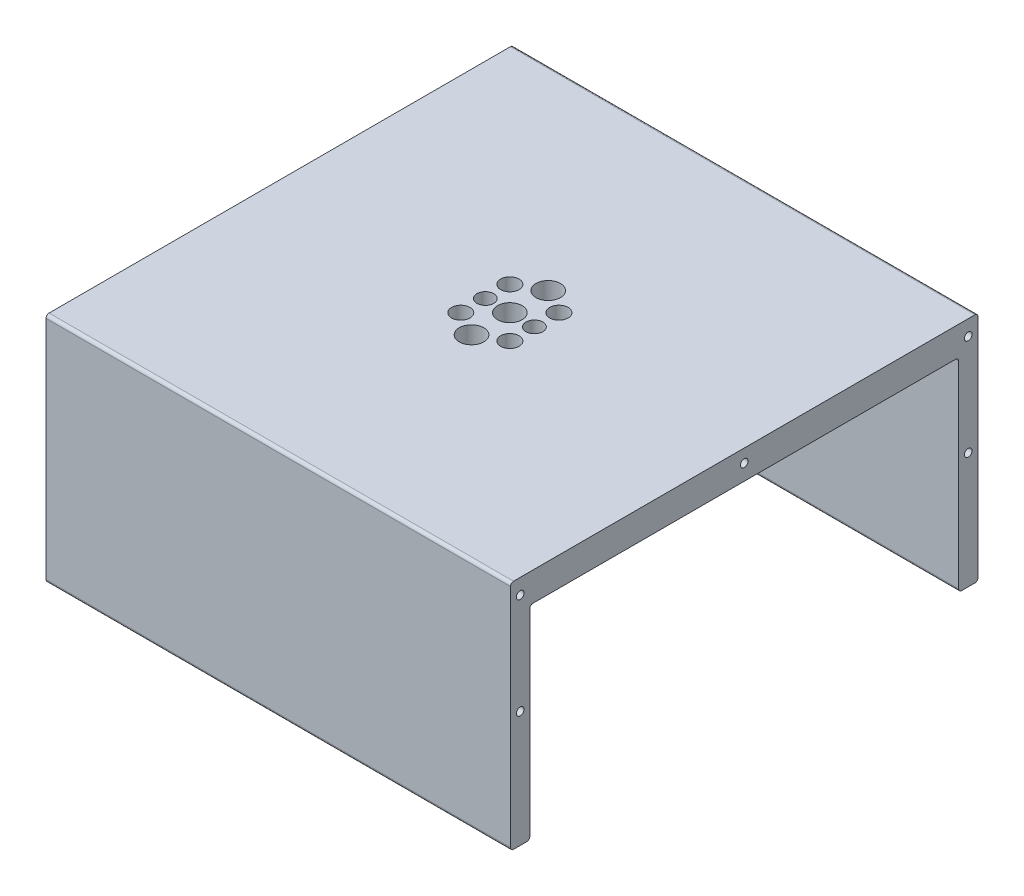
ISO-10303-21;
HEADER;
FILE_DESCRIPTION(('STEP AP214'),'2;1');
FILE_NAME('part.step','',(''),(''),'','','');
FILE_SCHEMA(('AUTOMOTIVE_DESIGN { 1 0 10303 214 1 1 1 1 }'));
ENDSEC;
DATA;
#1=APPLICATION_CONTEXT('core data for automotive mechanical design processes');
#2=APPLICATION_PROTOCOL_DEFINITION('international standard','automotive_design',2000,#1);
#3=PRODUCT_CONTEXT('',#1,'mechanical');
#4=PRODUCT('Part','Part','',(#3));
#5=PRODUCT_RELATED_PRODUCT_CATEGORY('part','',(#4));
#6=PRODUCT_DEFINITION_FORMATION('','',#4);
#7=PRODUCT_DEFINITION_CONTEXT('part definition',#1,'design');
#8=PRODUCT_DEFINITION('design','',#6,#7);
#9=PRODUCT_DEFINITION_SHAPE('','',#8);
#10=(LENGTH_UNIT() NAMED_UNIT(*) SI_UNIT(.MILLI.,.METRE.));
#11=(NAMED_UNIT(*) PLANE_ANGLE_UNIT() SI_UNIT($,.RADIAN.));
#12=(NAMED_UNIT(*) SI_UNIT($,.STERADIAN.) SOLID_ANGLE_UNIT());
#13=UNCERTAINTY_MEASURE_WITH_UNIT(LENGTH_MEASURE(1.E-05),#10,'distance_accuracy_value','');
#14=(GEOMETRIC_REPRESENTATION_CONTEXT(3) GLOBAL_UNCERTAINTY_ASSIGNED_CONTEXT((#13)) GLOBAL_UNIT_ASSIGNED_CONTEXT((#10,
#11,#12)) REPRESENTATION_CONTEXT('',''));
#15=CARTESIAN_POINT('',(0.,0.,0.));
#16=DIRECTION('',(0.,0.,1.));
#17=DIRECTION('',(1.,0.,0.));
#18=AXIS2_PLACEMENT_3D('',#15,#16,#17);
#19=CARTESIAN_POINT('',(151.4,27.45,-68.9));
#20=DIRECTION('',(-1.,0.,0.));
#21=DIRECTION('',(0.,0.,1.));
#22=AXIS2_PLACEMENT_3D('',#19,#20,#21);
#23=CYLINDRICAL_SURFACE('',#22,1.);
#24=CARTESIAN_POINT('',(0.,27.45,-68.9));
#25=DIRECTION('',(-1.,0.,0.));
#26=DIRECTION('',(0.,0.,-1.));
#27=AXIS2_PLACEMENT_3D('',#24,#25,#26);
#28=CIRCLE('',#27,1.);
#29=CARTESIAN_POINT('',(0.,28.45,-68.9));
#30=VERTEX_POINT('',#29);
#31=CARTESIAN_POINT('',(0.,27.45,-69.9));
#32=VERTEX_POINT('',#31);
#33=EDGE_CURVE('E192',#30,#32,#28,.T.);
#34=ORIENTED_EDGE('',*,*,#33,.T.);
#35=DIRECTION('',(-1.,0.,0.));
#36=VECTOR('',#35,1.);
#37=CARTESIAN_POINT('',(151.4,27.45,-69.9));
#38=LINE('',#37,#36);
#39=CARTESIAN_POINT('',(151.4,27.45,-69.9));
#40=VERTEX_POINT('',#39);
#41=EDGE_CURVE('E12',#40,#32,#38,.T.);
#42=ORIENTED_EDGE('',*,*,#41,.F.);
#43=CARTESIAN_POINT('',(151.4,27.45,-68.9));
#44=DIRECTION('',(-1.,0.,0.));
#45=DIRECTION('',(0.,0.,-1.));
#46=AXIS2_PLACEMENT_3D('',#43,#44,#45);
#47=CIRCLE('',#46,1.);
#48=CARTESIAN_POINT('',(151.4,28.45,-68.9));
#49=VERTEX_POINT('',#48);
#50=EDGE_CURVE('E336',#49,#40,#47,.T.);
#51=ORIENTED_EDGE('',*,*,#50,.F.);
#52=DIRECTION('',(-1.,0.,0.));
#53=VECTOR('',#52,1.);
#54=CARTESIAN_POINT('',(151.4,28.45,-68.9));
#55=LINE('',#54,#53);
#56=EDGE_CURVE('E188',#49,#30,#55,.T.);
#57=ORIENTED_EDGE('',*,*,#56,.T.);
#58=EDGE_LOOP('',(#34,#42,#51,#57));
#59=FACE_BOUND('',#58,.T.);
#60=ADVANCED_FACE('F43',(#59),#23,.F.);
#61=CARTESIAN_POINT('',(151.4,27.45,-69.9));
#62=DIRECTION('',(0.,0.,-1.));
#63=DIRECTION('',(0.,1.,0.));
#64=AXIS2_PLACEMENT_3D('',#61,#62,#63);
#65=PLANE('',#64);
#66=DIRECTION('',(0.,-1.,0.));
#67=VECTOR('',#66,1.);
#68=CARTESIAN_POINT('',(0.,27.45,-69.9));
#69=LINE('',#68,#67);
#70=CARTESIAN_POINT('',(0.,-36.85,-69.9));
#71=VERTEX_POINT('',#70);
#72=EDGE_CURVE('E195',#32,#71,#69,.T.);
#73=ORIENTED_EDGE('',*,*,#72,.T.);
#74=DIRECTION('',(-1.,0.,0.));
#75=VECTOR('',#74,1.);
#76=CARTESIAN_POINT('',(151.4,-36.85,-69.9));
#77=LINE('',#76,#75);
#78=CARTESIAN_POINT('',(151.4,-36.85,-69.9));
#79=VERTEX_POINT('',#78);
#80=EDGE_CURVE('E52',#79,#71,#77,.T.);
#81=ORIENTED_EDGE('',*,*,#80,.F.);
#82=DIRECTION('',(0.,-1.,0.));
#83=VECTOR('',#82,1.);
#84=CARTESIAN_POINT('',(151.4,27.45,-69.9));
#85=LINE('',#84,#83);
#86=EDGE_CURVE('E129',#40,#79,#85,.T.);
#87=ORIENTED_EDGE('',*,*,#86,.F.);
#88=ORIENTED_EDGE('',*,*,#41,.T.);
#89=EDGE_LOOP('',(#73,#81,#87,#88));
#90=FACE_BOUND('',#89,.T.);
#91=ADVANCED_FACE('F412',(#90),#65,.F.);
#92=CARTESIAN_POINT('',(151.4,-36.85,-70.9));
#93=DIRECTION('',(-1.,0.,0.));
#94=DIRECTION('',(0.,0.,1.));
#95=AXIS2_PLACEMENT_3D('',#92,#93,#94);
#96=CYLINDRICAL_SURFACE('',#95,0.999999999999997);
#97=CARTESIAN_POINT('',(0.,-36.85,-70.9));
#98=DIRECTION('',(1.,0.,0.));
#99=DIRECTION('',(0.,0.,1.));
#100=AXIS2_PLACEMENT_3D('',#97,#98,#99);
#101=CIRCLE('',#100,0.999999999999997);
#102=CARTESIAN_POINT('',(0.,-37.85,-70.9));
#103=VERTEX_POINT('',#102);
#104=EDGE_CURVE('E198',#71,#103,#101,.T.);
#105=ORIENTED_EDGE('',*,*,#104,.T.);
#106=DIRECTION('',(-1.,0.,0.));
#107=VECTOR('',#106,1.);
#108=CARTESIAN_POINT('',(151.4,-37.85,-70.9));
#109=LINE('',#108,#107);
#110=CARTESIAN_POINT('',(151.4,-37.85,-70.9));
#111=VERTEX_POINT('',#110);
#112=EDGE_CURVE('E239',#111,#103,#109,.T.);
#113=ORIENTED_EDGE('',*,*,#112,.F.);
#114=CARTESIAN_POINT('',(151.4,-36.85,-70.9));
#115=DIRECTION('',(1.,0.,0.));
#116=DIRECTION('',(0.,0.,1.));
#117=AXIS2_PLACEMENT_3D('',#114,#115,#116);
#118=CIRCLE('',#117,0.999999999999997);
#119=EDGE_CURVE('E339',#79,#111,#118,.T.);
#120=ORIENTED_EDGE('',*,*,#119,.F.);
#121=ORIENTED_EDGE('',*,*,#80,.T.);
#122=EDGE_LOOP('',(#105,#113,#120,#121));
#123=FACE_BOUND('',#122,.T.);
#124=ADVANCED_FACE('F414',(#123),#96,.T.);
#125=CARTESIAN_POINT('',(151.4,-37.85,-70.9));
#126=DIRECTION('',(0.,1.,0.));
#127=DIRECTION('',(0.,0.,1.));
#128=AXIS2_PLACEMENT_3D('',#125,#126,#127);
#129=PLANE('',#128);
#130=DIRECTION('',(0.,0.,-1.));
#131=VECTOR('',#130,1.);
#132=CARTESIAN_POINT('',(0.,-37.85,-70.9));
#133=LINE('',#132,#131);
#134=CARTESIAN_POINT('',(0.,-37.85,-75.2));
#135=VERTEX_POINT('',#134);
#136=EDGE_CURVE('E200',#103,#135,#133,.T.);
#137=ORIENTED_EDGE('',*,*,#136,.T.);
#138=DIRECTION('',(-1.,0.,0.));
#139=VECTOR('',#138,1.);
#140=CARTESIAN_POINT('',(151.4,-37.85,-75.2));
#141=LINE('',#140,#139);
#142=CARTESIAN_POINT('',(151.4,-37.85,-75.2));
#143=VERTEX_POINT('',#142);
#144=EDGE_CURVE('E236',#143,#135,#141,.T.);
#145=ORIENTED_EDGE('',*,*,#144,.F.);
#146=DIRECTION('',(0.,0.,-1.));
#147=VECTOR('',#146,1.);
#148=CARTESIAN_POINT('',(151.4,-37.85,-70.9));
#149=LINE('',#148,#147);
#150=EDGE_CURVE('E341',#111,#143,#149,.T.);
#151=ORIENTED_EDGE('',*,*,#150,.F.);
#152=ORIENTED_EDGE('',*,*,#112,.T.);
#153=EDGE_LOOP('',(#137,#145,#151,#152));
#154=FACE_BOUND('',#153,.T.);
#155=ADVANCED_FACE('F419',(#154),#129,.F.);
#156=CARTESIAN_POINT('',(151.4,-36.85,-75.2));
#157=DIRECTION('',(-1.,0.,0.));
#158=DIRECTION('',(0.,0.,1.));
#159=AXIS2_PLACEMENT_3D('',#156,#157,#158);
#160=CYLINDRICAL_SURFACE('',#159,0.999999999999997);
#161=CARTESIAN_POINT('',(0.,-36.85,-75.2));
#162=DIRECTION('',(1.,0.,0.));
#163=DIRECTION('',(0.,0.,1.));
#164=AXIS2_PLACEMENT_3D('',#161,#162,#163);
#165=CIRCLE('',#164,0.999999999999997);
#166=CARTESIAN_POINT('',(0.,-36.85,-76.2));
#167=VERTEX_POINT('',#166);
#168=EDGE_CURVE('E202',#135,#167,#165,.T.);
#169=ORIENTED_EDGE('',*,*,#168,.T.);
#170=DIRECTION('',(-1.,0.,0.));
#171=VECTOR('',#170,1.);
#172=CARTESIAN_POINT('',(151.4,-36.85,-76.2));
#173=LINE('',#172,#171);
#174=CARTESIAN_POINT('',(151.4,-36.85,-76.2));
#175=VERTEX_POINT('',#174);
#176=EDGE_CURVE('E233',#175,#167,#173,.T.);
#177=ORIENTED_EDGE('',*,*,#176,.F.);
#178=CARTESIAN_POINT('',(151.4,-36.85,-75.2));
#179=DIRECTION('',(1.,0.,0.));
#180=DIRECTION('',(0.,0.,1.));
#181=AXIS2_PLACEMENT_3D('',#178,#179,#180);
#182=CIRCLE('',#181,0.999999999999997);
#183=EDGE_CURVE('E343',#143,#175,#182,.T.);
#184=ORIENTED_EDGE('',*,*,#183,.F.);
#185=ORIENTED_EDGE('',*,*,#144,.T.);
#186=EDGE_LOOP('',(#169,#177,#184,#185));
#187=FACE_BOUND('',#186,.T.);
#188=ADVANCED_FACE('F425',(#187),#160,.T.);
#189=CARTESIAN_POINT('',(151.4,36.85,-76.2));
#190=DIRECTION('',(0.,0.,1.));
#191=DIRECTION('',(0.,-1.,0.));
#192=AXIS2_PLACEMENT_3D('',#189,#190,#191);
#193=PLANE('',#192);
#194=DIRECTION('',(0.,1.,0.));
#195=VECTOR('',#194,1.);
#196=CARTESIAN_POINT('',(0.,36.85,-76.2));
#197=LINE('',#196,#195);
#198=CARTESIAN_POINT('',(0.,36.85,-76.2));
#199=VERTEX_POINT('',#198);
#200=EDGE_CURVE('E204',#167,#199,#197,.T.);
#201=ORIENTED_EDGE('',*,*,#200,.T.);
#202=DIRECTION('',(-1.,0.,0.));
#203=VECTOR('',#202,1.);
#204=CARTESIAN_POINT('',(151.4,36.85,-76.2));
#205=LINE('',#204,#203);
#206=CARTESIAN_POINT('',(151.4,36.85,-76.2));
#207=VERTEX_POINT('',#206);
#208=EDGE_CURVE('E230',#207,#199,#205,.T.);
#209=ORIENTED_EDGE('',*,*,#208,.F.);
#210=DIRECTION('',(0.,1.,0.));
#211=VECTOR('',#210,1.);
#212=CARTESIAN_POINT('',(151.4,36.85,-76.2));
#213=LINE('',#212,#211);
#214=EDGE_CURVE('E345',#175,#207,#213,.T.);
#215=ORIENTED_EDGE('',*,*,#214,.F.);
#216=ORIENTED_EDGE('',*,*,#176,.T.);
#217=EDGE_LOOP('',(#201,#209,#215,#216));
#218=FACE_BOUND('',#217,.T.);
#219=ADVANCED_FACE('F429',(#218),#193,.F.);
#220=CARTESIAN_POINT('',(151.4,36.85,-75.2));
#221=DIRECTION('',(-1.,0.,0.));
#222=DIRECTION('',(0.,0.,1.));
#223=AXIS2_PLACEMENT_3D('',#220,#221,#222);
#224=CYLINDRICAL_SURFACE('',#223,1.);
#225=CARTESIAN_POINT('',(0.,36.85,-75.2));
#226=DIRECTION('',(1.,0.,0.));
#227=DIRECTION('',(0.,0.,-1.));
#228=AXIS2_PLACEMENT_3D('',#225,#226,#227);
#229=CIRCLE('',#228,1.);
#230=CARTESIAN_POINT('',(0.,37.85,-75.2));
#231=VERTEX_POINT('',#230);
#232=EDGE_CURVE('E206',#199,#231,#229,.T.);
#233=ORIENTED_EDGE('',*,*,#232,.T.);
#234=DIRECTION('',(-1.,0.,0.));
#235=VECTOR('',#234,1.);
#236=CARTESIAN_POINT('',(151.4,37.85,-75.2));
#237=LINE('',#236,#235);
#238=CARTESIAN_POINT('',(151.4,37.85,-75.2));
#239=VERTEX_POINT('',#238);
#240=EDGE_CURVE('E224',#239,#231,#237,.T.);
#241=ORIENTED_EDGE('',*,*,#240,.F.);
#242=CARTESIAN_POINT('',(151.4,36.85,-75.2));
#243=DIRECTION('',(1.,0.,0.));
#244=DIRECTION('',(0.,0.,-1.));
#245=AXIS2_PLACEMENT_3D('',#242,#243,#244);
#246=CIRCLE('',#245,1.);
#247=EDGE_CURVE('E347',#207,#239,#246,.T.);
#248=ORIENTED_EDGE('',*,*,#247,.F.);
#249=ORIENTED_EDGE('',*,*,#208,.T.);
#250=EDGE_LOOP('',(#233,#241,#248,#249));
#251=FACE_BOUND('',#250,.T.);
#252=ADVANCED_FACE('F434',(#251),#224,.T.);
#253=CARTESIAN_POINT('',(151.4,37.85,75.2));
#254=DIRECTION('',(0.,-1.,0.));
#255=DIRECTION('',(0.,0.,-1.));
#256=AXIS2_PLACEMENT_3D('',#253,#254,#255);
#257=PLANE('',#256);
#258=CARTESIAN_POINT('',(83.,37.85,-8.00000000000041));
#259=DIRECTION('',(0.,1.,0.));
#260=DIRECTION('',(0.,0.,1.));
#261=AXIS2_PLACEMENT_3D('',#258,#259,#260);
#262=CIRCLE('',#261,3.);
#263=CARTESIAN_POINT('',(83.,37.85,-5.00000000000041));
#264=VERTEX_POINT('',#263);
#265=EDGE_CURVE('E256',#264,#264,#262,.T.);
#266=ORIENTED_EDGE('',*,*,#265,.F.);
#267=EDGE_LOOP('',(#266));
#268=FACE_BOUND('',#267,.T.);
#269=CARTESIAN_POINT('',(83.0000000000004,37.85,7.99999999999962));
#270=DIRECTION('',(0.,1.,0.));
#271=DIRECTION('',(0.,0.,1.));
#272=AXIS2_PLACEMENT_3D('',#269,#270,#271);
#273=CIRCLE('',#272,3.);
#274=CARTESIAN_POINT('',(83.0000000000004,37.85,10.9999999999996));
#275=VERTEX_POINT('',#274);
#276=EDGE_CURVE('E861',#275,#275,#273,.T.);
#277=ORIENTED_EDGE('',*,*,#276,.F.);
#278=EDGE_LOOP('',(#277));
#279=FACE_BOUND('',#278,.T.);
#280=CARTESIAN_POINT('',(67.0000000000004,37.85,7.99999999999991));
#281=DIRECTION('',(0.,1.,0.));
#282=DIRECTION('',(0.,0.,1.));
#283=AXIS2_PLACEMENT_3D('',#280,#281,#282);
#284=CIRCLE('',#283,3.00000000000001);
#285=CARTESIAN_POINT('',(67.0000000000004,37.85,10.9999999999999));
#286=VERTEX_POINT('',#285);
#287=EDGE_CURVE('E270',#286,#286,#284,.T.);
#288=ORIENTED_EDGE('',*,*,#287,.F.);
#289=EDGE_LOOP('',(#288));
#290=FACE_BOUND('',#289,.T.);
#291=CARTESIAN_POINT('',(67.,37.85,-8.));
#292=DIRECTION('',(0.,1.,0.));
#293=DIRECTION('',(0.,0.,1.));
#294=AXIS2_PLACEMENT_3D('',#291,#292,#293);
#295=CIRCLE('',#294,3.00000000000001);
#296=CARTESIAN_POINT('',(67.,37.85,-4.99999999999999));
#297=VERTEX_POINT('',#296);
#298=EDGE_CURVE('E252',#297,#297,#295,.T.);
#299=ORIENTED_EDGE('',*,*,#298,.F.);
#300=EDGE_LOOP('',(#299));
#301=FACE_BOUND('',#300,.T.);
#302=CARTESIAN_POINT('',(83.,37.85,2.16493489801906E-12));
#303=DIRECTION('',(0.,1.,0.));
#304=DIRECTION('',(0.,0.,1.));
#305=AXIS2_PLACEMENT_3D('',#302,#303,#304);
#306=CIRCLE('',#305,2.74999999999999);
#307=CARTESIAN_POINT('',(83.,37.85,2.75000000000215));
#308=VERTEX_POINT('',#307);
#309=EDGE_CURVE('E248',#308,#308,#306,.T.);
#310=ORIENTED_EDGE('',*,*,#309,.F.);
#311=EDGE_LOOP('',(#310));
#312=FACE_BOUND('',#311,.T.);
#313=CARTESIAN_POINT('',(67.,37.85,1.40165656858926E-12));
#314=DIRECTION('',(0.,1.,0.));
#315=DIRECTION('',(0.,0.,1.));
#316=AXIS2_PLACEMENT_3D('',#313,#314,#315);
#317=CIRCLE('',#316,2.74999999999999);
#318=CARTESIAN_POINT('',(67.,37.85,2.75000000000139));
#319=VERTEX_POINT('',#318);
#320=EDGE_CURVE('E247',#319,#319,#317,.T.);
#321=ORIENTED_EDGE('',*,*,#320,.F.);
#322=EDGE_LOOP('',(#321));
#323=FACE_BOUND('',#322,.T.);
#324=CARTESIAN_POINT('',(75.,37.85,12.5));
#325=DIRECTION('',(0.,1.,0.));
#326=DIRECTION('',(0.,0.,1.));
#327=AXIS2_PLACEMENT_3D('',#324,#325,#326);
#328=CIRCLE('',#327,3.99999999999999);
#329=CARTESIAN_POINT('',(75.,37.85,16.5));
#330=VERTEX_POINT('',#329);
#331=EDGE_CURVE('E317',#330,#330,#328,.T.);
#332=ORIENTED_EDGE('',*,*,#331,.F.);
#333=EDGE_LOOP('',(#332));
#334=FACE_BOUND('',#333,.T.);
#335=CARTESIAN_POINT('',(75.,37.85,-12.5));
#336=DIRECTION('',(0.,1.,0.));
#337=DIRECTION('',(0.,0.,1.));
#338=AXIS2_PLACEMENT_3D('',#335,#336,#337);
#339=CIRCLE('',#338,3.99999999999999);
#340=CARTESIAN_POINT('',(75.,37.85,-8.50000000000001));
#341=VERTEX_POINT('',#340);
#342=EDGE_CURVE('E324',#341,#341,#339,.T.);
#343=ORIENTED_EDGE('',*,*,#342,.F.);
#344=EDGE_LOOP('',(#343));
#345=FACE_BOUND('',#344,.T.);
#346=CARTESIAN_POINT('',(75.,37.85,0.));
#347=DIRECTION('',(0.,1.,0.));
#348=DIRECTION('',(0.,0.,1.));
#349=AXIS2_PLACEMENT_3D('',#346,#347,#348);
#350=CIRCLE('',#349,3.99999999999999);
#351=CARTESIAN_POINT('',(75.,37.85,3.99999999999999));
#352=VERTEX_POINT('',#351);
#353=EDGE_CURVE('E330',#352,#352,#350,.T.);
#354=ORIENTED_EDGE('',*,*,#353,.F.);
#355=EDGE_LOOP('',(#354));
#356=FACE_BOUND('',#355,.T.);
#357=DIRECTION('',(0.,0.,1.));
#358=VECTOR('',#357,1.);
#359=CARTESIAN_POINT('',(0.,37.85,75.2));
#360=LINE('',#359,#358);
#361=CARTESIAN_POINT('',(0.,37.85,75.2));
#362=VERTEX_POINT('',#361);
#363=EDGE_CURVE('E208',#231,#362,#360,.T.);
#364=ORIENTED_EDGE('',*,*,#363,.T.);
#365=DIRECTION('',(-1.,0.,0.));
#366=VECTOR('',#365,1.);
#367=CARTESIAN_POINT('',(151.4,37.85,75.2));
#368=LINE('',#367,#366);
#369=CARTESIAN_POINT('',(151.4,37.85,75.2));
#370=VERTEX_POINT('',#369);
#371=EDGE_CURVE('E220',#370,#362,#368,.T.);
#372=ORIENTED_EDGE('',*,*,#371,.F.);
#373=DIRECTION('',(0.,0.,1.));
#374=VECTOR('',#373,1.);
#375=CARTESIAN_POINT('',(151.4,37.85,75.2));
#376=LINE('',#375,#374);
#377=EDGE_CURVE('E348',#239,#370,#376,.T.);
#378=ORIENTED_EDGE('',*,*,#377,.F.);
#379=ORIENTED_EDGE('',*,*,#240,.T.);
#380=EDGE_LOOP('',(#364,#372,#378,#379));
#381=FACE_BOUND('',#380,.T.);
#382=ADVANCED_FACE('F438',(#268,#279,#290,#301,#312,#323,#334,#345,#356,#381),#257,.F.);
#383=CARTESIAN_POINT('',(151.4,36.85,75.2));
#384=DIRECTION('',(-1.,0.,0.));
#385=DIRECTION('',(0.,0.,1.));
#386=AXIS2_PLACEMENT_3D('',#383,#384,#385);
#387=CYLINDRICAL_SURFACE('',#386,1.);
#388=CARTESIAN_POINT('',(0.,36.85,75.2));
#389=DIRECTION('',(1.,0.,0.));
#390=DIRECTION('',(0.,0.,-1.));
#391=AXIS2_PLACEMENT_3D('',#388,#389,#390);
#392=CIRCLE('',#391,1.);
#393=CARTESIAN_POINT('',(0.,36.85,76.2));
#394=VERTEX_POINT('',#393);
#395=EDGE_CURVE('E211',#362,#394,#392,.T.);
#396=ORIENTED_EDGE('',*,*,#395,.T.);
#397=DIRECTION('',(-1.,0.,0.));
#398=VECTOR('',#397,1.);
#399=CARTESIAN_POINT('',(151.4,36.85,76.2));
#400=LINE('',#399,#398);
#401=CARTESIAN_POINT('',(151.4,36.85,76.2));
#402=VERTEX_POINT('',#401);
#403=EDGE_CURVE('E225',#402,#394,#400,.T.);
#404=ORIENTED_EDGE('',*,*,#403,.F.);
#405=CARTESIAN_POINT('',(151.4,36.85,75.2));
#406=DIRECTION('',(1.,0.,0.));
#407=DIRECTION('',(0.,0.,-1.));
#408=AXIS2_PLACEMENT_3D('',#405,#406,#407);
#409=CIRCLE('',#408,1.);
#410=EDGE_CURVE('E351',#370,#402,#409,.T.);
#411=ORIENTED_EDGE('',*,*,#410,.F.);
#412=ORIENTED_EDGE('',*,*,#371,.T.);
#413=EDGE_LOOP('',(#396,#404,#411,#412));
#414=FACE_BOUND('',#413,.T.);
#415=ADVANCED_FACE('F439',(#414),#387,.T.);
#416=CARTESIAN_POINT('',(151.4,36.85,76.2));
#417=DIRECTION('',(0.,0.,-1.));
#418=DIRECTION('',(0.,1.,0.));
#419=AXIS2_PLACEMENT_3D('',#416,#417,#418);
#420=PLANE('',#419);
#421=DIRECTION('',(0.,-1.,0.));
#422=VECTOR('',#421,1.);
#423=CARTESIAN_POINT('',(0.,36.85,76.2));
#424=LINE('',#423,#422);
#425=CARTESIAN_POINT('',(0.,-36.85,76.2));
#426=VERTEX_POINT('',#425);
#427=EDGE_CURVE('E389',#394,#426,#424,.T.);
#428=ORIENTED_EDGE('',*,*,#427,.T.);
#429=DIRECTION('',(-1.,0.,0.));
#430=VECTOR('',#429,1.);
#431=CARTESIAN_POINT('',(151.4,-36.85,76.2));
#432=LINE('',#431,#430);
#433=CARTESIAN_POINT('',(151.4,-36.85,76.2));
#434=VERTEX_POINT('',#433);
#435=EDGE_CURVE('E378',#434,#426,#432,.T.);
#436=ORIENTED_EDGE('',*,*,#435,.F.);
#437=DIRECTION('',(0.,-1.,0.));
#438=VECTOR('',#437,1.);
#439=CARTESIAN_POINT('',(151.4,36.85,76.2));
#440=LINE('',#439,#438);
#441=EDGE_CURVE('E353',#402,#434,#440,.T.);
#442=ORIENTED_EDGE('',*,*,#441,.F.);
#443=ORIENTED_EDGE('',*,*,#403,.T.);
#444=EDGE_LOOP('',(#428,#436,#442,#443));
#445=FACE_BOUND('',#444,.T.);
#446=ADVANCED_FACE('F388',(#445),#420,.F.);
#447=CARTESIAN_POINT('',(151.4,-36.85,75.2));
#448=DIRECTION('',(-1.,0.,0.));
#449=DIRECTION('',(0.,0.,1.));
#450=AXIS2_PLACEMENT_3D('',#447,#448,#449);
#451=CYLINDRICAL_SURFACE('',#450,1.);
#452=CARTESIAN_POINT('',(0.,-36.85,75.2));
#453=DIRECTION('',(1.,0.,0.));
#454=DIRECTION('',(0.,0.,1.));
#455=AXIS2_PLACEMENT_3D('',#452,#453,#454);
#456=CIRCLE('',#455,1.);
#457=CARTESIAN_POINT('',(0.,-37.85,75.2));
#458=VERTEX_POINT('',#457);
#459=EDGE_CURVE('E397',#426,#458,#456,.T.);
#460=ORIENTED_EDGE('',*,*,#459,.T.);
#461=DIRECTION('',(-1.,0.,0.));
#462=VECTOR('',#461,1.);
#463=CARTESIAN_POINT('',(151.4,-37.85,75.2));
#464=LINE('',#463,#462);
#465=CARTESIAN_POINT('',(151.4,-37.85,75.2));
#466=VERTEX_POINT('',#465);
#467=EDGE_CURVE('E371',#466,#458,#464,.T.);
#468=ORIENTED_EDGE('',*,*,#467,.F.);
#469=CARTESIAN_POINT('',(151.4,-36.85,75.2));
#470=DIRECTION('',(1.,0.,0.));
#471=DIRECTION('',(0.,0.,1.));
#472=AXIS2_PLACEMENT_3D('',#469,#470,#471);
#473=CIRCLE('',#472,1.);
#474=EDGE_CURVE('E355',#434,#466,#473,.T.);
#475=ORIENTED_EDGE('',*,*,#474,.F.);
#476=ORIENTED_EDGE('',*,*,#435,.T.);
#477=EDGE_LOOP('',(#460,#468,#475,#476));
#478=FACE_BOUND('',#477,.T.);
#479=ADVANCED_FACE('F446',(#478),#451,.T.);
#480=CARTESIAN_POINT('',(151.4,-37.85,75.2));
#481=DIRECTION('',(0.,1.,0.));
#482=DIRECTION('',(0.,0.,1.));
#483=AXIS2_PLACEMENT_3D('',#480,#481,#482);
#484=PLANE('',#483);
#485=DIRECTION('',(0.,0.,-1.));
#486=VECTOR('',#485,1.);
#487=CARTESIAN_POINT('',(0.,-37.85,75.2));
#488=LINE('',#487,#486);
#489=CARTESIAN_POINT('',(0.,-37.85,70.9));
#490=VERTEX_POINT('',#489);
#491=EDGE_CURVE('E368',#458,#490,#488,.T.);
#492=ORIENTED_EDGE('',*,*,#491,.T.);
#493=DIRECTION('',(-1.,0.,0.));
#494=VECTOR('',#493,1.);
#495=CARTESIAN_POINT('',(151.4,-37.85,70.9));
#496=LINE('',#495,#494);
#497=CARTESIAN_POINT('',(151.4,-37.85,70.9));
#498=VERTEX_POINT('',#497);
#499=EDGE_CURVE('E365',#498,#490,#496,.T.);
#500=ORIENTED_EDGE('',*,*,#499,.F.);
#501=DIRECTION('',(0.,0.,-1.));
#502=VECTOR('',#501,1.);
#503=CARTESIAN_POINT('',(151.4,-37.85,75.2));
#504=LINE('',#503,#502);
#505=EDGE_CURVE('E357',#466,#498,#504,.T.);
#506=ORIENTED_EDGE('',*,*,#505,.F.);
#507=ORIENTED_EDGE('',*,*,#467,.T.);
#508=EDGE_LOOP('',(#492,#500,#506,#507));
#509=FACE_BOUND('',#508,.T.);
#510=ADVANCED_FACE('F366',(#509),#484,.F.);
#511=CARTESIAN_POINT('',(151.4,-36.85,70.9));
#512=DIRECTION('',(-1.,0.,0.));
#513=DIRECTION('',(0.,0.,1.));
#514=AXIS2_PLACEMENT_3D('',#511,#512,#513);
#515=CYLINDRICAL_SURFACE('',#514,1.);
#516=CARTESIAN_POINT('',(0.,-36.85,70.9));
#517=DIRECTION('',(1.,0.,0.));
#518=DIRECTION('',(0.,0.,1.));
#519=AXIS2_PLACEMENT_3D('',#516,#517,#518);
#520=CIRCLE('',#519,1.);
#521=CARTESIAN_POINT('',(0.,-36.85,69.9));
#522=VERTEX_POINT('',#521);
#523=EDGE_CURVE('E374',#490,#522,#520,.T.);
#524=ORIENTED_EDGE('',*,*,#523,.T.);
#525=DIRECTION('',(-1.,0.,0.));
#526=VECTOR('',#525,1.);
#527=CARTESIAN_POINT('',(151.4,-36.85,69.9));
#528=LINE('',#527,#526);
#529=CARTESIAN_POINT('',(151.4,-36.85,69.9));
#530=VERTEX_POINT('',#529);
#531=EDGE_CURVE('E183',#530,#522,#528,.T.);
#532=ORIENTED_EDGE('',*,*,#531,.F.);
#533=CARTESIAN_POINT('',(151.4,-36.85,70.9));
#534=DIRECTION('',(1.,0.,0.));
#535=DIRECTION('',(0.,0.,1.));
#536=AXIS2_PLACEMENT_3D('',#533,#534,#535);
#537=CIRCLE('',#536,1.);
#538=EDGE_CURVE('E174',#498,#530,#537,.T.);
#539=ORIENTED_EDGE('',*,*,#538,.F.);
#540=ORIENTED_EDGE('',*,*,#499,.T.);
#541=EDGE_LOOP('',(#524,#532,#539,#540));
#542=FACE_BOUND('',#541,.T.);
#543=ADVANCED_FACE('F373',(#542),#515,.T.);
#544=CARTESIAN_POINT('',(151.4,-36.85,69.9));
#545=DIRECTION('',(0.,0.,1.));
#546=DIRECTION('',(0.,-1.,0.));
#547=AXIS2_PLACEMENT_3D('',#544,#545,#546);
#548=PLANE('',#547);
#549=DIRECTION('',(0.,1.,0.));
#550=VECTOR('',#549,1.);
#551=CARTESIAN_POINT('',(0.,-36.85,69.9));
#552=LINE('',#551,#550);
#553=CARTESIAN_POINT('',(0.,27.45,69.9));
#554=VERTEX_POINT('',#553);
#555=EDGE_CURVE('E182',#522,#554,#552,.T.);
#556=ORIENTED_EDGE('',*,*,#555,.T.);
#557=DIRECTION('',(-1.,0.,0.));
#558=VECTOR('',#557,1.);
#559=CARTESIAN_POINT('',(151.4,27.45,69.9));
#560=LINE('',#559,#558);
#561=CARTESIAN_POINT('',(151.4,27.45,69.9));
#562=VERTEX_POINT('',#561);
#563=EDGE_CURVE('E179',#562,#554,#560,.T.);
#564=ORIENTED_EDGE('',*,*,#563,.F.);
#565=DIRECTION('',(0.,1.,0.));
#566=VECTOR('',#565,1.);
#567=CARTESIAN_POINT('',(151.4,-36.85,69.9));
#568=LINE('',#567,#566);
#569=EDGE_CURVE('E168',#530,#562,#568,.T.);
#570=ORIENTED_EDGE('',*,*,#569,.F.);
#571=ORIENTED_EDGE('',*,*,#531,.T.);
#572=EDGE_LOOP('',(#556,#564,#570,#571));
#573=FACE_BOUND('',#572,.T.);
#574=ADVANCED_FACE('F180',(#573),#548,.F.);
#575=CARTESIAN_POINT('',(151.4,27.45,68.9));
#576=DIRECTION('',(-1.,0.,0.));
#577=DIRECTION('',(0.,0.,1.));
#578=AXIS2_PLACEMENT_3D('',#575,#576,#577);
#579=CYLINDRICAL_SURFACE('',#578,1.00000000000001);
#580=CARTESIAN_POINT('',(0.,27.45,68.9));
#581=DIRECTION('',(-1.,0.,0.));
#582=DIRECTION('',(0.,0.,-1.));
#583=AXIS2_PLACEMENT_3D('',#580,#581,#582);
#584=CIRCLE('',#583,1.00000000000001);
#585=CARTESIAN_POINT('',(0.,28.45,68.9));
#586=VERTEX_POINT('',#585);
#587=EDGE_CURVE('E115',#554,#586,#584,.T.);
#588=ORIENTED_EDGE('',*,*,#587,.T.);
#589=DIRECTION('',(-1.,0.,0.));
#590=VECTOR('',#589,1.);
#591=CARTESIAN_POINT('',(151.4,28.45,68.9));
#592=LINE('',#591,#590);
#593=CARTESIAN_POINT('',(151.4,28.45,68.9));
#594=VERTEX_POINT('',#593);
#595=EDGE_CURVE('E184',#594,#586,#592,.T.);
#596=ORIENTED_EDGE('',*,*,#595,.F.);
#597=CARTESIAN_POINT('',(151.4,27.45,68.9));
#598=DIRECTION('',(-1.,0.,0.));
#599=DIRECTION('',(0.,0.,-1.));
#600=AXIS2_PLACEMENT_3D('',#597,#598,#599);
#601=CIRCLE('',#600,1.00000000000001);
#602=EDGE_CURVE('E172',#562,#594,#601,.T.);
#603=ORIENTED_EDGE('',*,*,#602,.F.);
#604=ORIENTED_EDGE('',*,*,#563,.T.);
#605=EDGE_LOOP('',(#588,#596,#603,#604));
#606=FACE_BOUND('',#605,.T.);
#607=ADVANCED_FACE('F186',(#606),#579,.F.);
#608=CARTESIAN_POINT('',(151.4,28.45,68.9));
#609=DIRECTION('',(0.,1.,0.));
#610=DIRECTION('',(0.,0.,1.));
#611=AXIS2_PLACEMENT_3D('',#608,#609,#610);
#612=PLANE('',#611);
#613=CARTESIAN_POINT('',(83.,28.45,-8.00000000000041));
#614=DIRECTION('',(0.,1.,0.));
#615=DIRECTION('',(0.,0.,1.));
#616=AXIS2_PLACEMENT_3D('',#613,#614,#615);
#617=CIRCLE('',#616,3.);
#618=CARTESIAN_POINT('',(83.,28.45,-5.00000000000041));
#619=VERTEX_POINT('',#618);
#620=EDGE_CURVE('E46',#619,#619,#617,.T.);
#621=ORIENTED_EDGE('',*,*,#620,.T.);
#622=EDGE_LOOP('',(#621));
#623=FACE_BOUND('',#622,.T.);
#624=CARTESIAN_POINT('',(83.0000000000004,28.45,7.99999999999962));
#625=DIRECTION('',(0.,1.,0.));
#626=DIRECTION('',(0.,0.,1.));
#627=AXIS2_PLACEMENT_3D('',#624,#625,#626);
#628=CIRCLE('',#627,3.);
#629=CARTESIAN_POINT('',(83.0000000000004,28.45,10.9999999999996));
#630=VERTEX_POINT('',#629);
#631=EDGE_CURVE('E255',#630,#630,#628,.T.);
#632=ORIENTED_EDGE('',*,*,#631,.T.);
#633=EDGE_LOOP('',(#632));
#634=FACE_BOUND('',#633,.T.);
#635=CARTESIAN_POINT('',(67.0000000000004,28.45,7.99999999999991));
#636=DIRECTION('',(0.,1.,0.));
#637=DIRECTION('',(0.,0.,1.));
#638=AXIS2_PLACEMENT_3D('',#635,#636,#637);
#639=CIRCLE('',#638,3.00000000000001);
#640=CARTESIAN_POINT('',(67.0000000000004,28.45,10.9999999999999));
#641=VERTEX_POINT('',#640);
#642=EDGE_CURVE('E253',#641,#641,#639,.T.);
#643=ORIENTED_EDGE('',*,*,#642,.T.);
#644=EDGE_LOOP('',(#643));
#645=FACE_BOUND('',#644,.T.);
#646=CARTESIAN_POINT('',(67.,28.45,-8.));
#647=DIRECTION('',(0.,1.,0.));
#648=DIRECTION('',(0.,0.,1.));
#649=AXIS2_PLACEMENT_3D('',#646,#647,#648);
#650=CIRCLE('',#649,3.00000000000001);
#651=CARTESIAN_POINT('',(67.,28.45,-4.99999999999999));
#652=VERTEX_POINT('',#651);
#653=EDGE_CURVE('E249',#652,#652,#650,.T.);
#654=ORIENTED_EDGE('',*,*,#653,.T.);
#655=EDGE_LOOP('',(#654));
#656=FACE_BOUND('',#655,.T.);
#657=CARTESIAN_POINT('',(83.,28.45,2.16493489801906E-12));
#658=DIRECTION('',(0.,1.,0.));
#659=DIRECTION('',(0.,0.,1.));
#660=AXIS2_PLACEMENT_3D('',#657,#658,#659);
#661=CIRCLE('',#660,2.74999999999998);
#662=CARTESIAN_POINT('',(83.,28.45,2.75000000000215));
#663=VERTEX_POINT('',#662);
#664=EDGE_CURVE('E244',#663,#663,#661,.T.);
#665=ORIENTED_EDGE('',*,*,#664,.T.);
#666=EDGE_LOOP('',(#665));
#667=FACE_BOUND('',#666,.T.);
#668=CARTESIAN_POINT('',(67.,28.45,1.40165656858926E-12));
#669=DIRECTION('',(0.,1.,0.));
#670=DIRECTION('',(0.,0.,1.));
#671=AXIS2_PLACEMENT_3D('',#668,#669,#670);
#672=CIRCLE('',#671,2.74999999999998);
#673=CARTESIAN_POINT('',(67.,28.45,2.75000000000138));
#674=VERTEX_POINT('',#673);
#675=EDGE_CURVE('E285',#674,#674,#672,.T.);
#676=ORIENTED_EDGE('',*,*,#675,.T.);
#677=EDGE_LOOP('',(#676));
#678=FACE_BOUND('',#677,.T.);
#679=CARTESIAN_POINT('',(75.,28.45,12.5));
#680=DIRECTION('',(0.,1.,0.));
#681=DIRECTION('',(0.,0.,1.));
#682=AXIS2_PLACEMENT_3D('',#679,#680,#681);
#683=CIRCLE('',#682,3.99999999999998);
#684=CARTESIAN_POINT('',(75.,28.45,16.5));
#685=VERTEX_POINT('',#684);
#686=EDGE_CURVE('E321',#685,#685,#683,.T.);
#687=ORIENTED_EDGE('',*,*,#686,.T.);
#688=EDGE_LOOP('',(#687));
#689=FACE_BOUND('',#688,.T.);
#690=CARTESIAN_POINT('',(75.,28.45,-12.5));
#691=DIRECTION('',(0.,1.,0.));
#692=DIRECTION('',(0.,0.,1.));
#693=AXIS2_PLACEMENT_3D('',#690,#691,#692);
#694=CIRCLE('',#693,3.99999999999998);
#695=CARTESIAN_POINT('',(75.,28.45,-8.50000000000002));
#696=VERTEX_POINT('',#695);
#697=EDGE_CURVE('E328',#696,#696,#694,.T.);
#698=ORIENTED_EDGE('',*,*,#697,.T.);
#699=EDGE_LOOP('',(#698));
#700=FACE_BOUND('',#699,.T.);
#701=CARTESIAN_POINT('',(75.,28.45,0.));
#702=DIRECTION('',(0.,1.,0.));
#703=DIRECTION('',(0.,0.,1.));
#704=AXIS2_PLACEMENT_3D('',#701,#702,#703);
#705=CIRCLE('',#704,3.99999999999998);
#706=CARTESIAN_POINT('',(75.,28.45,3.99999999999998));
#707=VERTEX_POINT('',#706);
#708=EDGE_CURVE('E196',#707,#707,#705,.T.);
#709=ORIENTED_EDGE('',*,*,#708,.T.);
#710=EDGE_LOOP('',(#709));
#711=FACE_BOUND('',#710,.T.);
#712=DIRECTION('',(0.,0.,-1.));
#713=VECTOR('',#712,1.);
#714=CARTESIAN_POINT('',(0.,28.45,68.9));
#715=LINE('',#714,#713);
#716=EDGE_CURVE('E121',#586,#30,#715,.T.);
#717=ORIENTED_EDGE('',*,*,#716,.T.);
#718=ORIENTED_EDGE('',*,*,#56,.F.);
#719=DIRECTION('',(0.,0.,-1.));
#720=VECTOR('',#719,1.);
#721=CARTESIAN_POINT('',(151.4,28.45,68.9));
#722=LINE('',#721,#720);
#723=EDGE_CURVE('E61',#594,#49,#722,.T.);
#724=ORIENTED_EDGE('',*,*,#723,.F.);
#725=ORIENTED_EDGE('',*,*,#595,.T.);
#726=EDGE_LOOP('',(#717,#718,#724,#725));
#727=FACE_BOUND('',#726,.T.);
#728=ADVANCED_FACE('F405',(#623,#634,#645,#656,#667,#678,#689,#700,#711,#727),#612,.F.);
#729=CARTESIAN_POINT('',(151.4,27.45,-68.9));
#730=DIRECTION('',(1.,0.,0.));
#731=DIRECTION('',(0.,0.,-1.));
#732=AXIS2_PLACEMENT_3D('',#729,#730,#731);
#733=PLANE('',#732);
#734=CARTESIAN_POINT('',(151.4,0.,73.025));
#735=DIRECTION('',(1.,0.,0.));
#736=DIRECTION('',(0.,0.,-1.));
#737=AXIS2_PLACEMENT_3D('',#734,#735,#736);
#738=CIRCLE('',#737,1.24999999999999);
#739=CARTESIAN_POINT('',(151.4,0.,71.775));
#740=VERTEX_POINT('',#739);
#741=EDGE_CURVE('E288',#740,#740,#738,.T.);
#742=ORIENTED_EDGE('',*,*,#741,.F.);
#743=EDGE_LOOP('',(#742));
#744=FACE_BOUND('',#743,.T.);
#745=CARTESIAN_POINT('',(151.4,32.85,73.025));
#746=DIRECTION('',(1.,0.,0.));
#747=DIRECTION('',(0.,0.,-1.));
#748=AXIS2_PLACEMENT_3D('',#745,#746,#747);
#749=CIRCLE('',#748,1.24999999999999);
#750=CARTESIAN_POINT('',(151.4,32.85,71.775));
#751=VERTEX_POINT('',#750);
#752=EDGE_CURVE('E294',#751,#751,#749,.T.);
#753=ORIENTED_EDGE('',*,*,#752,.F.);
#754=EDGE_LOOP('',(#753));
#755=FACE_BOUND('',#754,.T.);
#756=CARTESIAN_POINT('',(151.4,33.5750190962773,0.));
#757=DIRECTION('',(1.,0.,0.));
#758=DIRECTION('',(0.,0.,-1.));
#759=AXIS2_PLACEMENT_3D('',#756,#757,#758);
#760=CIRCLE('',#759,1.24999999999999);
#761=CARTESIAN_POINT('',(151.4,33.5750190962773,-1.24999999999996));
#762=VERTEX_POINT('',#761);
#763=EDGE_CURVE('E300',#762,#762,#760,.T.);
#764=ORIENTED_EDGE('',*,*,#763,.F.);
#765=EDGE_LOOP('',(#764));
#766=FACE_BOUND('',#765,.T.);
#767=CARTESIAN_POINT('',(151.4,0.,-73.025));
#768=DIRECTION('',(1.,0.,0.));
#769=DIRECTION('',(0.,0.,-1.));
#770=AXIS2_PLACEMENT_3D('',#767,#768,#769);
#771=CIRCLE('',#770,1.24999999999999);
#772=CARTESIAN_POINT('',(151.4,0.,-74.275));
#773=VERTEX_POINT('',#772);
#774=EDGE_CURVE('E306',#773,#773,#771,.T.);
#775=ORIENTED_EDGE('',*,*,#774,.F.);
#776=EDGE_LOOP('',(#775));
#777=FACE_BOUND('',#776,.T.);
#778=CARTESIAN_POINT('',(151.4,32.85,-73.025));
#779=DIRECTION('',(1.,0.,0.));
#780=DIRECTION('',(0.,0.,-1.));
#781=AXIS2_PLACEMENT_3D('',#778,#779,#780);
#782=CIRCLE('',#781,1.24999999999999);
#783=CARTESIAN_POINT('',(151.4,32.85,-74.275));
#784=VERTEX_POINT('',#783);
#785=EDGE_CURVE('E312',#784,#784,#782,.T.);
#786=ORIENTED_EDGE('',*,*,#785,.F.);
#787=EDGE_LOOP('',(#786));
#788=FACE_BOUND('',#787,.T.);
#789=ORIENTED_EDGE('',*,*,#50,.T.);
#790=ORIENTED_EDGE('',*,*,#86,.T.);
#791=ORIENTED_EDGE('',*,*,#119,.T.);
#792=ORIENTED_EDGE('',*,*,#150,.T.);
#793=ORIENTED_EDGE('',*,*,#183,.T.);
#794=ORIENTED_EDGE('',*,*,#214,.T.);
#795=ORIENTED_EDGE('',*,*,#247,.T.);
#796=ORIENTED_EDGE('',*,*,#377,.T.);
#797=ORIENTED_EDGE('',*,*,#410,.T.);
#798=ORIENTED_EDGE('',*,*,#441,.T.);
#799=ORIENTED_EDGE('',*,*,#474,.T.);
#800=ORIENTED_EDGE('',*,*,#505,.T.);
#801=ORIENTED_EDGE('',*,*,#538,.T.);
#802=ORIENTED_EDGE('',*,*,#569,.T.);
#803=ORIENTED_EDGE('',*,*,#602,.T.);
#804=ORIENTED_EDGE('',*,*,#723,.T.);
#805=EDGE_LOOP('',(#789,#790,#791,#792,#793,#794,#795,#796,#797,#798,#799,#800,#801,#802,#803,#804));
#806=FACE_BOUND('',#805,.T.);
#807=ADVANCED_FACE('F170',(#744,#755,#766,#777,#788,#806),#733,.T.);
#808=CARTESIAN_POINT('',(0.,27.45,-68.9));
#809=DIRECTION('',(1.,0.,0.));
#810=DIRECTION('',(0.,0.,-1.));
#811=AXIS2_PLACEMENT_3D('',#808,#809,#810);
#812=PLANE('',#811);
#813=ORIENTED_EDGE('',*,*,#33,.F.);
#814=ORIENTED_EDGE('',*,*,#716,.F.);
#815=ORIENTED_EDGE('',*,*,#587,.F.);
#816=ORIENTED_EDGE('',*,*,#555,.F.);
#817=ORIENTED_EDGE('',*,*,#523,.F.);
#818=ORIENTED_EDGE('',*,*,#491,.F.);
#819=ORIENTED_EDGE('',*,*,#459,.F.);
#820=ORIENTED_EDGE('',*,*,#427,.F.);
#821=ORIENTED_EDGE('',*,*,#395,.F.);
#822=ORIENTED_EDGE('',*,*,#363,.F.);
#823=ORIENTED_EDGE('',*,*,#232,.F.);
#824=ORIENTED_EDGE('',*,*,#200,.F.);
#825=ORIENTED_EDGE('',*,*,#168,.F.);
#826=ORIENTED_EDGE('',*,*,#136,.F.);
#827=ORIENTED_EDGE('',*,*,#104,.F.);
#828=ORIENTED_EDGE('',*,*,#72,.F.);
#829=EDGE_LOOP('',(#813,#814,#815,#816,#817,#818,#819,#820,#821,#822,#823,#824,#825,#826,#827,#828));
#830=FACE_BOUND('',#829,.T.);
#831=ADVANCED_FACE('F395',(#830),#812,.F.);
#832=CARTESIAN_POINT('',(75.,37.85,0.));
#833=DIRECTION('',(0.,1.,0.));
#834=DIRECTION('',(0.,0.,1.));
#835=AXIS2_PLACEMENT_3D('',#832,#833,#834);
#836=CYLINDRICAL_SURFACE('',#835,3.99999999999998);
#837=ORIENTED_EDGE('',*,*,#353,.T.);
#838=EDGE_LOOP('',(#837));
#839=FACE_BOUND('',#838,.T.);
#840=ORIENTED_EDGE('',*,*,#708,.F.);
#841=EDGE_LOOP('',(#840));
#842=FACE_BOUND('',#841,.T.);
#843=ADVANCED_FACE('F592',(#839,#842),#836,.F.);
#844=CARTESIAN_POINT('',(75.,37.85,-12.5));
#845=DIRECTION('',(0.,1.,0.));
#846=DIRECTION('',(0.,0.,1.));
#847=AXIS2_PLACEMENT_3D('',#844,#845,#846);
#848=CYLINDRICAL_SURFACE('',#847,3.99999999999998);
#849=ORIENTED_EDGE('',*,*,#342,.T.);
#850=EDGE_LOOP('',(#849));
#851=FACE_BOUND('',#850,.T.);
#852=ORIENTED_EDGE('',*,*,#697,.F.);
#853=EDGE_LOOP('',(#852));
#854=FACE_BOUND('',#853,.T.);
#855=ADVANCED_FACE('F588',(#851,#854),#848,.F.);
#856=CARTESIAN_POINT('',(75.,37.85,12.5));
#857=DIRECTION('',(0.,1.,0.));
#858=DIRECTION('',(0.,0.,1.));
#859=AXIS2_PLACEMENT_3D('',#856,#857,#858);
#860=CYLINDRICAL_SURFACE('',#859,3.99999999999998);
#861=ORIENTED_EDGE('',*,*,#331,.T.);
#862=EDGE_LOOP('',(#861));
#863=FACE_BOUND('',#862,.T.);
#864=ORIENTED_EDGE('',*,*,#686,.F.);
#865=EDGE_LOOP('',(#864));
#866=FACE_BOUND('',#865,.T.);
#867=ADVANCED_FACE('F584',(#863,#866),#860,.F.);
#868=CARTESIAN_POINT('',(143.9,32.85,-73.025));
#869=DIRECTION('',(1.,0.,0.));
#870=DIRECTION('',(0.,0.,-1.));
#871=AXIS2_PLACEMENT_3D('',#868,#869,#870);
#872=CONICAL_SURFACE('',#871,1.24999999999999,1.02974425867665);
#873=CARTESIAN_POINT('',(143.148924226216,32.85,-73.025));
#874=VERTEX_POINT('',#873);
#875=VERTEX_LOOP('',#874);
#876=FACE_BOUND('',#875,.T.);
#877=CARTESIAN_POINT('',(143.9,32.85,-73.025));
#878=DIRECTION('',(1.,0.,0.));
#879=DIRECTION('',(0.,0.,-1.));
#880=AXIS2_PLACEMENT_3D('',#877,#878,#879);
#881=CIRCLE('',#880,1.24999999999999);
#882=CARTESIAN_POINT('',(143.9,32.85,-74.275));
#883=VERTEX_POINT('',#882);
#884=EDGE_CURVE('E315',#883,#883,#881,.T.);
#885=ORIENTED_EDGE('',*,*,#884,.T.);
#886=EDGE_LOOP('',(#885));
#887=FACE_BOUND('',#886,.T.);
#888=ADVANCED_FACE('F580',(#876,#887),#872,.F.);
#889=CARTESIAN_POINT('',(151.4,32.85,-73.025));
#890=DIRECTION('',(1.,0.,0.));
#891=DIRECTION('',(0.,0.,-1.));
#892=AXIS2_PLACEMENT_3D('',#889,#890,#891);
#893=CYLINDRICAL_SURFACE('',#892,1.24999999999999);
#894=ORIENTED_EDGE('',*,*,#884,.F.);
#895=EDGE_LOOP('',(#894));
#896=FACE_BOUND('',#895,.T.);
#897=ORIENTED_EDGE('',*,*,#785,.T.);
#898=EDGE_LOOP('',(#897));
#899=FACE_BOUND('',#898,.T.);
#900=ADVANCED_FACE('F576',(#896,#899),#893,.F.);
#901=CARTESIAN_POINT('',(143.9,0.,-73.025));
#902=DIRECTION('',(1.,0.,0.));
#903=DIRECTION('',(0.,0.,-1.));
#904=AXIS2_PLACEMENT_3D('',#901,#902,#903);
#905=CONICAL_SURFACE('',#904,1.24999999999999,1.02974425867665);
#906=CARTESIAN_POINT('',(143.148924226216,0.,-73.025));
#907=VERTEX_POINT('',#906);
#908=VERTEX_LOOP('',#907);
#909=FACE_BOUND('',#908,.T.);
#910=CARTESIAN_POINT('',(143.9,0.,-73.025));
#911=DIRECTION('',(1.,0.,0.));
#912=DIRECTION('',(0.,0.,-1.));
#913=AXIS2_PLACEMENT_3D('',#910,#911,#912);
#914=CIRCLE('',#913,1.24999999999999);
#915=CARTESIAN_POINT('',(143.9,0.,-74.275));
#916=VERTEX_POINT('',#915);
#917=EDGE_CURVE('E309',#916,#916,#914,.T.);
#918=ORIENTED_EDGE('',*,*,#917,.T.);
#919=EDGE_LOOP('',(#918));
#920=FACE_BOUND('',#919,.T.);
#921=ADVANCED_FACE('F572',(#909,#920),#905,.F.);
#922=CARTESIAN_POINT('',(151.4,0.,-73.025));
#923=DIRECTION('',(1.,0.,0.));
#924=DIRECTION('',(0.,0.,-1.));
#925=AXIS2_PLACEMENT_3D('',#922,#923,#924);
#926=CYLINDRICAL_SURFACE('',#925,1.24999999999999);
#927=ORIENTED_EDGE('',*,*,#917,.F.);
#928=EDGE_LOOP('',(#927));
#929=FACE_BOUND('',#928,.T.);
#930=ORIENTED_EDGE('',*,*,#774,.T.);
#931=EDGE_LOOP('',(#930));
#932=FACE_BOUND('',#931,.T.);
#933=ADVANCED_FACE('F568',(#929,#932),#926,.F.);
#934=CARTESIAN_POINT('',(143.9,33.5750190962773,0.));
#935=DIRECTION('',(1.,0.,0.));
#936=DIRECTION('',(0.,0.,-1.));
#937=AXIS2_PLACEMENT_3D('',#934,#935,#936);
#938=CONICAL_SURFACE('',#937,1.24999999999999,1.02974425867665);
#939=CARTESIAN_POINT('',(143.148924226216,33.5750190962773,0.));
#940=VERTEX_POINT('',#939);
#941=VERTEX_LOOP('',#940);
#942=FACE_BOUND('',#941,.T.);
#943=CARTESIAN_POINT('',(143.9,33.5750190962773,0.));
#944=DIRECTION('',(1.,0.,0.));
#945=DIRECTION('',(0.,0.,-1.));
#946=AXIS2_PLACEMENT_3D('',#943,#944,#945);
#947=CIRCLE('',#946,1.24999999999999);
#948=CARTESIAN_POINT('',(143.9,33.5750190962773,-1.24999999999996));
#949=VERTEX_POINT('',#948);
#950=EDGE_CURVE('E303',#949,#949,#947,.T.);
#951=ORIENTED_EDGE('',*,*,#950,.T.);
#952=EDGE_LOOP('',(#951));
#953=FACE_BOUND('',#952,.T.);
#954=ADVANCED_FACE('F564',(#942,#953),#938,.F.);
#955=CARTESIAN_POINT('',(151.4,33.5750190962773,0.));
#956=DIRECTION('',(1.,0.,0.));
#957=DIRECTION('',(0.,0.,-1.));
#958=AXIS2_PLACEMENT_3D('',#955,#956,#957);
#959=CYLINDRICAL_SURFACE('',#958,1.24999999999999);
#960=ORIENTED_EDGE('',*,*,#950,.F.);
#961=EDGE_LOOP('',(#960));
#962=FACE_BOUND('',#961,.T.);
#963=ORIENTED_EDGE('',*,*,#763,.T.);
#964=EDGE_LOOP('',(#963));
#965=FACE_BOUND('',#964,.T.);
#966=ADVANCED_FACE('F560',(#962,#965),#959,.F.);
#967=CARTESIAN_POINT('',(143.9,32.85,73.025));
#968=DIRECTION('',(1.,0.,0.));
#969=DIRECTION('',(0.,0.,-1.));
#970=AXIS2_PLACEMENT_3D('',#967,#968,#969);
#971=CONICAL_SURFACE('',#970,1.24999999999999,1.02974425867665);
#972=CARTESIAN_POINT('',(143.148924226216,32.85,73.025));
#973=VERTEX_POINT('',#972);
#974=VERTEX_LOOP('',#973);
#975=FACE_BOUND('',#974,.T.);
#976=CARTESIAN_POINT('',(143.9,32.85,73.025));
#977=DIRECTION('',(1.,0.,0.));
#978=DIRECTION('',(0.,0.,-1.));
#979=AXIS2_PLACEMENT_3D('',#976,#977,#978);
#980=CIRCLE('',#979,1.24999999999999);
#981=CARTESIAN_POINT('',(143.9,32.85,71.775));
#982=VERTEX_POINT('',#981);
#983=EDGE_CURVE('E297',#982,#982,#980,.T.);
#984=ORIENTED_EDGE('',*,*,#983,.T.);
#985=EDGE_LOOP('',(#984));
#986=FACE_BOUND('',#985,.T.);
#987=ADVANCED_FACE('F556',(#975,#986),#971,.F.);
#988=CARTESIAN_POINT('',(151.4,32.85,73.025));
#989=DIRECTION('',(1.,0.,0.));
#990=DIRECTION('',(0.,0.,-1.));
#991=AXIS2_PLACEMENT_3D('',#988,#989,#990);
#992=CYLINDRICAL_SURFACE('',#991,1.24999999999999);
#993=ORIENTED_EDGE('',*,*,#983,.F.);
#994=EDGE_LOOP('',(#993));
#995=FACE_BOUND('',#994,.T.);
#996=ORIENTED_EDGE('',*,*,#752,.T.);
#997=EDGE_LOOP('',(#996));
#998=FACE_BOUND('',#997,.T.);
#999=ADVANCED_FACE('F552',(#995,#998),#992,.F.);
#1000=CARTESIAN_POINT('',(143.9,0.,73.025));
#1001=DIRECTION('',(1.,0.,0.));
#1002=DIRECTION('',(0.,0.,-1.));
#1003=AXIS2_PLACEMENT_3D('',#1000,#1001,#1002);
#1004=CONICAL_SURFACE('',#1003,1.24999999999999,1.02974425867665);
#1005=CARTESIAN_POINT('',(143.148924226216,0.,73.025));
#1006=VERTEX_POINT('',#1005);
#1007=VERTEX_LOOP('',#1006);
#1008=FACE_BOUND('',#1007,.T.);
#1009=CARTESIAN_POINT('',(143.9,0.,73.025));
#1010=DIRECTION('',(1.,0.,0.));
#1011=DIRECTION('',(0.,0.,-1.));
#1012=AXIS2_PLACEMENT_3D('',#1009,#1010,#1011);
#1013=CIRCLE('',#1012,1.24999999999999);
#1014=CARTESIAN_POINT('',(143.9,0.,71.775));
#1015=VERTEX_POINT('',#1014);
#1016=EDGE_CURVE('E291',#1015,#1015,#1013,.T.);
#1017=ORIENTED_EDGE('',*,*,#1016,.T.);
#1018=EDGE_LOOP('',(#1017));
#1019=FACE_BOUND('',#1018,.T.);
#1020=ADVANCED_FACE('F548',(#1008,#1019),#1004,.F.);
#1021=CARTESIAN_POINT('',(151.4,0.,73.025));
#1022=DIRECTION('',(1.,0.,0.));
#1023=DIRECTION('',(0.,0.,-1.));
#1024=AXIS2_PLACEMENT_3D('',#1021,#1022,#1023);
#1025=CYLINDRICAL_SURFACE('',#1024,1.24999999999999);
#1026=ORIENTED_EDGE('',*,*,#1016,.F.);
#1027=EDGE_LOOP('',(#1026));
#1028=FACE_BOUND('',#1027,.T.);
#1029=ORIENTED_EDGE('',*,*,#741,.T.);
#1030=EDGE_LOOP('',(#1029));
#1031=FACE_BOUND('',#1030,.T.);
#1032=ADVANCED_FACE('F544',(#1028,#1031),#1025,.F.);
#1033=CARTESIAN_POINT('',(67.,37.85,1.40165656858926E-12));
#1034=DIRECTION('',(0.,1.,0.));
#1035=DIRECTION('',(0.,0.,1.));
#1036=AXIS2_PLACEMENT_3D('',#1033,#1034,#1035);
#1037=CYLINDRICAL_SURFACE('',#1036,2.74999999999998);
#1038=ORIENTED_EDGE('',*,*,#320,.T.);
#1039=EDGE_LOOP('',(#1038));
#1040=FACE_BOUND('',#1039,.T.);
#1041=ORIENTED_EDGE('',*,*,#675,.F.);
#1042=EDGE_LOOP('',(#1041));
#1043=FACE_BOUND('',#1042,.T.);
#1044=ADVANCED_FACE('F540',(#1040,#1043),#1037,.F.);
#1045=CARTESIAN_POINT('',(83.,37.85,2.16493489801906E-12));
#1046=DIRECTION('',(0.,1.,0.));
#1047=DIRECTION('',(0.,0.,1.));
#1048=AXIS2_PLACEMENT_3D('',#1045,#1046,#1047);
#1049=CYLINDRICAL_SURFACE('',#1048,2.74999999999998);
#1050=ORIENTED_EDGE('',*,*,#309,.T.);
#1051=EDGE_LOOP('',(#1050));
#1052=FACE_BOUND('',#1051,.T.);
#1053=ORIENTED_EDGE('',*,*,#664,.F.);
#1054=EDGE_LOOP('',(#1053));
#1055=FACE_BOUND('',#1054,.T.);
#1056=ADVANCED_FACE('F481',(#1052,#1055),#1049,.F.);
#1057=CARTESIAN_POINT('',(67.,-37.85,-8.));
#1058=DIRECTION('',(0.,1.,0.));
#1059=DIRECTION('',(0.,0.,1.));
#1060=AXIS2_PLACEMENT_3D('',#1057,#1058,#1059);
#1061=CYLINDRICAL_SURFACE('',#1060,3.00000000000001);
#1062=ORIENTED_EDGE('',*,*,#298,.T.);
#1063=EDGE_LOOP('',(#1062));
#1064=FACE_BOUND('',#1063,.T.);
#1065=ORIENTED_EDGE('',*,*,#653,.F.);
#1066=EDGE_LOOP('',(#1065));
#1067=FACE_BOUND('',#1066,.T.);
#1068=ADVANCED_FACE('F498',(#1064,#1067),#1061,.F.);
#1069=CARTESIAN_POINT('',(67.0000000000004,-37.85,7.99999999999991));
#1070=DIRECTION('',(0.,1.,0.));
#1071=DIRECTION('',(0.,0.,1.));
#1072=AXIS2_PLACEMENT_3D('',#1069,#1070,#1071);
#1073=CYLINDRICAL_SURFACE('',#1072,3.00000000000001);
#1074=ORIENTED_EDGE('',*,*,#287,.T.);
#1075=EDGE_LOOP('',(#1074));
#1076=FACE_BOUND('',#1075,.T.);
#1077=ORIENTED_EDGE('',*,*,#642,.F.);
#1078=EDGE_LOOP('',(#1077));
#1079=FACE_BOUND('',#1078,.T.);
#1080=ADVANCED_FACE('F503',(#1076,#1079),#1073,.F.);
#1081=CARTESIAN_POINT('',(83.0000000000004,-37.85,7.99999999999962));
#1082=DIRECTION('',(0.,1.,0.));
#1083=DIRECTION('',(0.,0.,1.));
#1084=AXIS2_PLACEMENT_3D('',#1081,#1082,#1083);
#1085=CYLINDRICAL_SURFACE('',#1084,3.);
#1086=ORIENTED_EDGE('',*,*,#276,.T.);
#1087=EDGE_LOOP('',(#1086));
#1088=FACE_BOUND('',#1087,.T.);
#1089=ORIENTED_EDGE('',*,*,#631,.F.);
#1090=EDGE_LOOP('',(#1089));
#1091=FACE_BOUND('',#1090,.T.);
#1092=ADVANCED_FACE('F512',(#1088,#1091),#1085,.F.);
#1093=CARTESIAN_POINT('',(83.,-37.85,-8.00000000000041));
#1094=DIRECTION('',(0.,1.,0.));
#1095=DIRECTION('',(0.,0.,1.));
#1096=AXIS2_PLACEMENT_3D('',#1093,#1094,#1095);
#1097=CYLINDRICAL_SURFACE('',#1096,3.);
#1098=ORIENTED_EDGE('',*,*,#265,.T.);
#1099=EDGE_LOOP('',(#1098));
#1100=FACE_BOUND('',#1099,.T.);
#1101=ORIENTED_EDGE('',*,*,#620,.F.);
#1102=EDGE_LOOP('',(#1101));
#1103=FACE_BOUND('',#1102,.T.);
#1104=ADVANCED_FACE('F522',(#1100,#1103),#1097,.F.);
#1105=CLOSED_SHELL('',(#60,#91,#124,#155,#188,#219,#252,#382,#415,#446,#479,#510,#543,#574,#607,
#728,#807,#831,#843,#855,#867,#888,#900,#921,#933,#954,#966,#987,#999,#1020,#1032,#1044,#1056,
#1068,#1080,#1092,#1104));
#1106=MANIFOLD_SOLID_BREP('B2',#1105);
#1107=ADVANCED_BREP_SHAPE_REPRESENTATION('',(#18,#1106),#14);
#1108=SHAPE_DEFINITION_REPRESENTATION(#9,#1107);
ENDSEC;
END-ISO-10303-21;
